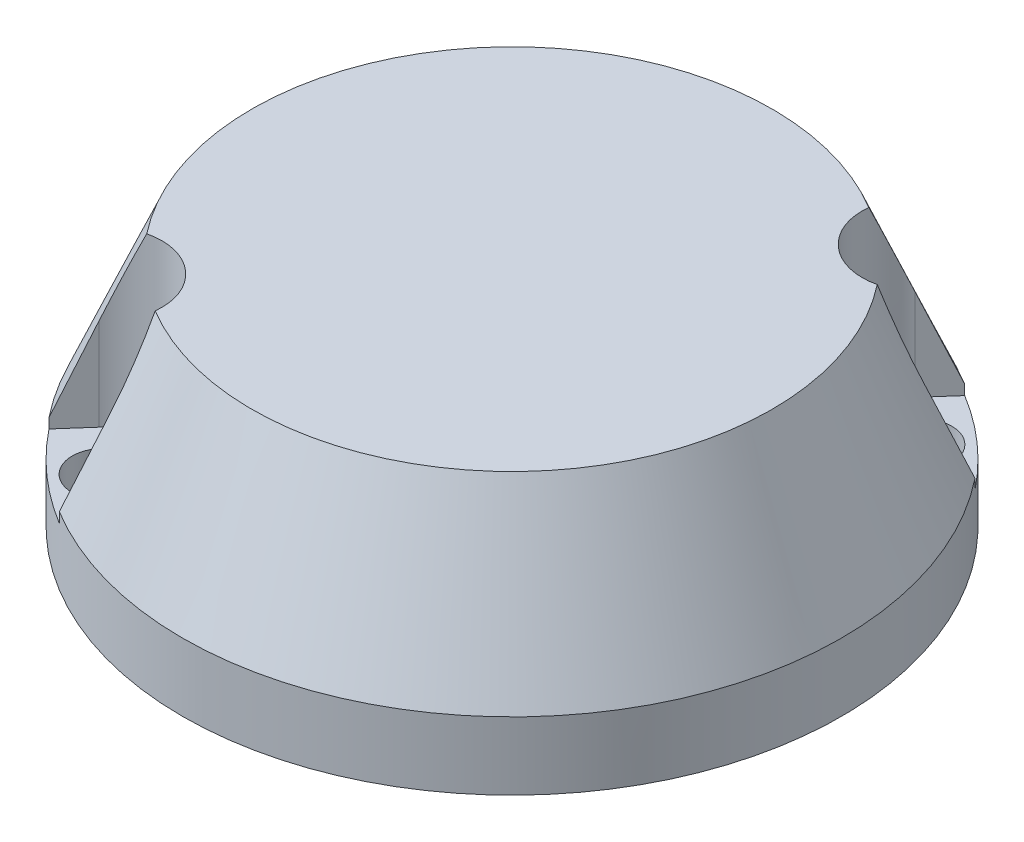
ISO-10303-21;
HEADER;
FILE_DESCRIPTION(('STEP AP214'),'2;1');
FILE_NAME('part.step','',(''),(''),'','','');
FILE_SCHEMA(('AUTOMOTIVE_DESIGN { 1 0 10303 214 1 1 1 1 }'));
ENDSEC;
DATA;
#1=APPLICATION_CONTEXT('core data for automotive mechanical design processes');
#2=APPLICATION_PROTOCOL_DEFINITION('international standard','automotive_design',2000,#1);
#3=PRODUCT_CONTEXT('',#1,'mechanical');
#4=PRODUCT('Part','Part','',(#3));
#5=PRODUCT_RELATED_PRODUCT_CATEGORY('part','',(#4));
#6=PRODUCT_DEFINITION_FORMATION('','',#4);
#7=PRODUCT_DEFINITION_CONTEXT('part definition',#1,'design');
#8=PRODUCT_DEFINITION('design','',#6,#7);
#9=PRODUCT_DEFINITION_SHAPE('','',#8);
#10=(LENGTH_UNIT() NAMED_UNIT(*) SI_UNIT(.MILLI.,.METRE.));
#11=(NAMED_UNIT(*) PLANE_ANGLE_UNIT() SI_UNIT($,.RADIAN.));
#12=(NAMED_UNIT(*) SI_UNIT($,.STERADIAN.) SOLID_ANGLE_UNIT());
#13=UNCERTAINTY_MEASURE_WITH_UNIT(LENGTH_MEASURE(1.E-05),#10,'distance_accuracy_value','');
#14=(GEOMETRIC_REPRESENTATION_CONTEXT(3) GLOBAL_UNCERTAINTY_ASSIGNED_CONTEXT((#13)) GLOBAL_UNIT_ASSIGNED_CONTEXT((#10,
#11,#12)) REPRESENTATION_CONTEXT('',''));
#15=CARTESIAN_POINT('',(0.,0.,0.));
#16=DIRECTION('',(0.,0.,1.));
#17=DIRECTION('',(1.,0.,0.));
#18=AXIS2_PLACEMENT_3D('',#15,#16,#17);
#19=CARTESIAN_POINT('',(0.,8.,0.));
#20=DIRECTION('',(0.,-1.,0.));
#21=DIRECTION('',(0.,0.,1.));
#22=AXIS2_PLACEMENT_3D('',#19,#20,#21);
#23=CONICAL_SURFACE('',#22,9.,0.401425727958697);
#24=CARTESIAN_POINT('',(5.11035817426889,5.1769811258257,-8.82550682634143));
#25=CARTESIAN_POINT('',(5.07661414252657,5.29489411257902,-8.7872079083931));
#26=CARTESIAN_POINT('',(5.04453820477151,5.41293164332908,-8.7478687942));
#27=CARTESIAN_POINT('',(4.983684376568,5.64917061454052,-8.66719651927363));
#28=CARTESIAN_POINT('',(4.95490636459641,5.76737204879977,-8.62586343209478));
#29=CARTESIAN_POINT('',(4.87366426051182,6.12121119448239,-8.49931891607739));
#30=CARTESIAN_POINT('',(4.82603701593017,6.35697873678128,-8.41127059172088));
#31=CARTESIAN_POINT('',(4.76452538524851,6.71017917982828,-8.27369323198587));
#32=CARTESIAN_POINT('',(4.74567480700492,6.82785083108504,-8.22691101713601));
#33=CARTESIAN_POINT('',(4.71139486558539,7.06293065674025,-8.13146844146397));
#34=CARTESIAN_POINT('',(4.69596532587521,7.18033884442445,-8.08280817770609));
#35=CARTESIAN_POINT('',(4.66862920523462,7.41518393202808,-7.98335906569933));
#36=CARTESIAN_POINT('',(4.65673585977857,7.53261933333602,-7.93256301305176));
#37=CARTESIAN_POINT('',(4.63681088375759,7.76690346215636,-7.82885997493883));
#38=CARTESIAN_POINT('',(4.62877983784044,7.88375209820093,-7.77595267119898));
#39=CARTESIAN_POINT('',(4.62281272466691,8.0002,-7.72192167860607));
#40=B_SPLINE_CURVE_WITH_KNOTS('',3,(#24,#25,#26,#27,#28,#29,#30,#31,#32,#33,#34,#35,#36,#37,#38,
#39),.UNSPECIFIED.,.F.,.F.,(4,2,2,2,2,2,2,4),(0.,0.385420237370538,0.770826268069996,
1.53871691019087,1.92274931952882,2.30676190720727,2.69219421135587,3.07768484119002),.UNSPECIFIED.);
#41=CARTESIAN_POINT('',(5.11018193618688,5.1775969234557,-8.82530682634147));
#42=VERTEX_POINT('',#41);
#43=CARTESIAN_POINT('',(4.62282294249551,8.,-7.72201450674221));
#44=VERTEX_POINT('',#43);
#45=EDGE_CURVE('E59',#42,#44,#40,.T.);
#46=ORIENTED_EDGE('',*,*,#45,.F.);
#47=CARTESIAN_POINT('',(5.9188669005035,2.345754322023,-9.74314888660197));
#48=CARTESIAN_POINT('',(5.78428208585492,2.81797798492162,-9.5903976806225));
#49=CARTESIAN_POINT('',(5.6495845807939,3.29012801219817,-9.43751857316731));
#50=CARTESIAN_POINT('',(5.37996418788984,4.23428080236058,-9.13150455308419));
#51=CARTESIAN_POINT('',(5.24504130004354,4.70628356524432,-8.97836964045255));
#52=CARTESIAN_POINT('',(5.11000572178152,5.17821269250383,-8.82510682634147));
#53=B_SPLINE_CURVE_WITH_KNOTS('',3,(#47,#48,#49,#50,#51,#52),.UNSPECIFIED.,.F.,.F.,(4,2,4),(0.,
1.54271507045494,3.0854301633066),.UNSPECIFIED.);
#54=CARTESIAN_POINT('',(5.91880989390462,2.34595432202301,-9.74308418519602));
#55=VERTEX_POINT('',#54);
#56=EDGE_CURVE('E12',#55,#42,#53,.T.);
#57=ORIENTED_EDGE('',*,*,#56,.F.);
#58=CARTESIAN_POINT('',(0.,2.34595432202301,0.));
#59=DIRECTION('',(0.,-1.,0.));
#60=DIRECTION('',(0.,0.,-1.));
#61=AXIS2_PLACEMENT_3D('',#58,#59,#60);
#62=CIRCLE('',#61,11.4);
#63=CARTESIAN_POINT('',(-8.9200677550985,2.345954322023,7.09875983848249));
#64=VERTEX_POINT('',#63);
#65=EDGE_CURVE('E230',#55,#64,#62,.F.);
#66=ORIENTED_EDGE('',*,*,#65,.T.);
#67=CARTESIAN_POINT('',(-8.1112635829754,5.17821269250383,6.18078247962794));
#68=CARTESIAN_POINT('',(-8.24629916123742,4.70628356524431,6.33404529373902));
#69=CARTESIAN_POINT('',(-8.38122204908373,4.23428080236058,6.48718020637066));
#70=CARTESIAN_POINT('',(-8.65084244198778,3.29012801219817,6.79319422645378));
#71=CARTESIAN_POINT('',(-8.7855399470488,2.81797798492162,6.94607333390897));
#72=CARTESIAN_POINT('',(-8.92012476169738,2.34575432202301,7.09882453988844));
#73=B_SPLINE_CURVE_WITH_KNOTS('',3,(#67,#68,#69,#70,#71,#72),.UNSPECIFIED.,.F.,.F.,(4,2,4),(0.,
1.54271509285165,3.08543016330659),.UNSPECIFIED.);
#74=CARTESIAN_POINT('',(-8.11143979738076,5.17759692345569,6.18098247962794));
#75=VERTEX_POINT('',#74);
#76=EDGE_CURVE('E207',#75,#64,#73,.T.);
#77=ORIENTED_EDGE('',*,*,#76,.F.);
#78=CARTESIAN_POINT('',(-7.0782214895987,8.0002,5.5585297014635));
#79=CARTESIAN_POINT('',(-7.13107229575632,7.88374865693116,5.57125453565555));
#80=CARTESIAN_POINT('',(-7.18254834175311,7.76689655711164,5.58588545769892));
#81=CARTESIAN_POINT('',(-7.28291902512307,7.53260547275514,5.61871369183558));
#82=CARTESIAN_POINT('',(-7.33181405191502,7.41516657969603,5.63691046395733));
#83=CARTESIAN_POINT('',(-7.42703099974391,7.18031453153924,5.67655545697273));
#84=CARTESIAN_POINT('',(-7.47336173572109,7.06290287518881,5.69799145376629));
#85=CARTESIAN_POINT('',(-7.56372924501628,6.82781610833753,5.74402072868562));
#86=CARTESIAN_POINT('',(-7.60776589979398,6.71014098454976,5.76861416973658));
#87=CARTESIAN_POINT('',(-7.7365037696514,6.35693013246042,5.8469663758237));
#88=CARTESIAN_POINT('',(-7.81785438404316,6.12115565870482,5.90530609976952));
#89=CARTESIAN_POINT('',(-7.93316152707901,5.76730614665477,6.00184319765958));
#90=CARTESIAN_POINT('',(-7.97054174753684,5.6491012431839,6.03559926896931));
#91=CARTESIAN_POINT('',(-8.04290866620123,5.41285536352392,6.10613202216484));
#92=CARTESIAN_POINT('',(-8.07789527610745,5.29481439353954,6.14290881537511));
#93=CARTESIAN_POINT('',(-8.11163979738076,5.17689798709646,6.18120951044433));
#94=B_SPLINE_CURVE_WITH_KNOTS('',3,(#78,#79,#80,#81,#82,#83,#84,#85,#86,#87,#88,#89,#90,#91,#92,
#93),.UNSPECIFIED.,.F.,.F.,(4,2,2,2,2,2,2,4),(0.,0.385502017566442,0.77094570416487,
1.15496955297277,1.53901322551055,2.3069263826477,2.69234379483585,3.07777541742072),.UNSPECIFIED.);
#95=CARTESIAN_POINT('',(-7.07831229171185,8.,5.55855152904071));
#96=VERTEX_POINT('',#95);
#97=EDGE_CURVE('E242',#96,#75,#94,.T.);
#98=ORIENTED_EDGE('',*,*,#97,.F.);
#99=CARTESIAN_POINT('',(0.,8.,0.));
#100=DIRECTION('',(0.,1.,0.));
#101=DIRECTION('',(0.,0.,1.));
#102=AXIS2_PLACEMENT_3D('',#99,#100,#101);
#103=CIRCLE('',#102,9.);
#104=EDGE_CURVE('E301',#44,#96,#103,.T.);
#105=ORIENTED_EDGE('',*,*,#104,.F.);
#106=EDGE_LOOP('',(#46,#57,#66,#77,#98,#105));
#107=FACE_BOUND('',#106,.T.);
#108=ADVANCED_FACE('F38',(#107),#23,.T.);
#109=CARTESIAN_POINT('',(6.61081086678382,8.,-7.50314465298471));
#110=DIRECTION('',(0.,-1.,0.));
#111=DIRECTION('',(0.,0.,-1.));
#112=AXIS2_PLACEMENT_3D('',#109,#110,#111);
#113=CYLINDRICAL_SURFACE('',#112,1.1);
#114=CARTESIAN_POINT('',(6.61081086678382,0.,-7.50314465298471));
#115=DIRECTION('',(0.,-1.,0.));
#116=DIRECTION('',(0.,0.,1.));
#117=AXIS2_PLACEMENT_3D('',#114,#115,#116);
#118=CIRCLE('',#117,1.1);
#119=CARTESIAN_POINT('',(6.61081086678382,0.,-6.40314465298471));
#120=VERTEX_POINT('',#119);
#121=EDGE_CURVE('E296',#120,#120,#118,.T.);
#122=ORIENTED_EDGE('',*,*,#121,.T.);
#123=EDGE_LOOP('',(#122));
#124=FACE_BOUND('',#123,.T.);
#125=CARTESIAN_POINT('',(6.61081086678382,2.,-7.50314465298471));
#126=DIRECTION('',(0.,1.,0.));
#127=DIRECTION('',(0.,0.,1.));
#128=AXIS2_PLACEMENT_3D('',#125,#126,#127);
#129=CIRCLE('',#128,1.1);
#130=CARTESIAN_POINT('',(6.61081086678382,2.,-6.40314465298471));
#131=VERTEX_POINT('',#130);
#132=EDGE_CURVE('E154',#131,#131,#129,.F.);
#133=ORIENTED_EDGE('',*,*,#132,.F.);
#134=EDGE_LOOP('',(#133));
#135=FACE_BOUND('',#134,.T.);
#136=ADVANCED_FACE('F179',(#124,#135),#113,.F.);
#137=CARTESIAN_POINT('',(-6.61081086678382,8.,7.50314465298471));
#138=DIRECTION('',(0.,-1.,0.));
#139=DIRECTION('',(0.,0.,-1.));
#140=AXIS2_PLACEMENT_3D('',#137,#138,#139);
#141=CYLINDRICAL_SURFACE('',#140,1.1);
#142=CARTESIAN_POINT('',(-6.61081086678382,0.,7.50314465298471));
#143=DIRECTION('',(0.,-1.,0.));
#144=DIRECTION('',(0.,0.,-1.));
#145=AXIS2_PLACEMENT_3D('',#142,#143,#144);
#146=CIRCLE('',#145,1.1);
#147=CARTESIAN_POINT('',(-6.61081086678382,0.,6.40314465298471));
#148=VERTEX_POINT('',#147);
#149=EDGE_CURVE('E299',#148,#148,#146,.T.);
#150=ORIENTED_EDGE('',*,*,#149,.T.);
#151=EDGE_LOOP('',(#150));
#152=FACE_BOUND('',#151,.T.);
#153=CARTESIAN_POINT('',(-6.61081086678382,2.,7.50314465298471));
#154=DIRECTION('',(0.,1.,0.));
#155=DIRECTION('',(0.,0.,1.));
#156=AXIS2_PLACEMENT_3D('',#153,#154,#155);
#157=CIRCLE('',#156,1.1);
#158=CARTESIAN_POINT('',(-6.61081086678382,2.,8.6031446529847));
#159=VERTEX_POINT('',#158);
#160=EDGE_CURVE('E237',#159,#159,#157,.F.);
#161=ORIENTED_EDGE('',*,*,#160,.F.);
#162=EDGE_LOOP('',(#161));
#163=FACE_BOUND('',#162,.T.);
#164=ADVANCED_FACE('F183',(#152,#163),#141,.F.);
#165=CARTESIAN_POINT('',(0.,8.,0.));
#166=DIRECTION('',(0.,-1.,0.));
#167=DIRECTION('',(0.,0.,-1.));
#168=AXIS2_PLACEMENT_3D('',#165,#166,#167);
#169=CYLINDRICAL_SURFACE('',#168,11.4);
#170=ORIENTED_EDGE('',*,*,#65,.F.);
#171=DIRECTION('',(0.,-1.,0.));
#172=VECTOR('',#171,1.);
#173=CARTESIAN_POINT('',(5.91880989390462,8.,-9.74308418519602));
#174=LINE('',#173,#172);
#175=CARTESIAN_POINT('',(5.91880989390462,2.,-9.74308418519602));
#176=VERTEX_POINT('',#175);
#177=EDGE_CURVE('E227',#55,#176,#174,.T.);
#178=ORIENTED_EDGE('',*,*,#177,.T.);
#179=CARTESIAN_POINT('',(0.,2.,0.));
#180=DIRECTION('',(0.,1.,0.));
#181=DIRECTION('',(0.,0.,1.));
#182=AXIS2_PLACEMENT_3D('',#179,#180,#181);
#183=CIRCLE('',#182,11.4);
#184=CARTESIAN_POINT('',(8.9200677550985,2.,-7.0987598384825));
#185=VERTEX_POINT('',#184);
#186=EDGE_CURVE('E156',#185,#176,#183,.T.);
#187=ORIENTED_EDGE('',*,*,#186,.F.);
#188=DIRECTION('',(0.,-1.,0.));
#189=VECTOR('',#188,1.);
#190=CARTESIAN_POINT('',(8.9200677550985,8.,-7.09875983848249));
#191=LINE('',#190,#189);
#192=CARTESIAN_POINT('',(8.9200677550985,2.345954322023,-7.09875983848249));
#193=VERTEX_POINT('',#192);
#194=EDGE_CURVE('E138',#185,#193,#191,.F.);
#195=ORIENTED_EDGE('',*,*,#194,.T.);
#196=CARTESIAN_POINT('',(-5.91880989390462,2.34595432202301,9.74308418519602));
#197=VERTEX_POINT('',#196);
#198=EDGE_CURVE('E225',#197,#193,#62,.F.);
#199=ORIENTED_EDGE('',*,*,#198,.F.);
#200=DIRECTION('',(0.,-1.,0.));
#201=VECTOR('',#200,1.);
#202=CARTESIAN_POINT('',(-5.91880989390462,8.,9.74308418519602));
#203=LINE('',#202,#201);
#204=CARTESIAN_POINT('',(-5.91880989390462,2.,9.74308418519602));
#205=VERTEX_POINT('',#204);
#206=EDGE_CURVE('E302',#197,#205,#203,.T.);
#207=ORIENTED_EDGE('',*,*,#206,.T.);
#208=CARTESIAN_POINT('',(0.,2.,0.));
#209=DIRECTION('',(0.,1.,0.));
#210=DIRECTION('',(0.,0.,1.));
#211=AXIS2_PLACEMENT_3D('',#208,#209,#210);
#212=CIRCLE('',#211,11.4);
#213=CARTESIAN_POINT('',(-8.9200677550985,2.,7.0987598384825));
#214=VERTEX_POINT('',#213);
#215=EDGE_CURVE('E239',#214,#205,#212,.T.);
#216=ORIENTED_EDGE('',*,*,#215,.F.);
#217=DIRECTION('',(0.,-1.,0.));
#218=VECTOR('',#217,1.);
#219=CARTESIAN_POINT('',(-8.9200677550985,8.,7.09875983848249));
#220=LINE('',#219,#218);
#221=EDGE_CURVE('E303',#214,#64,#220,.F.);
#222=ORIENTED_EDGE('',*,*,#221,.T.);
#223=EDGE_LOOP('',(#170,#178,#187,#195,#199,#207,#216,#222));
#224=FACE_BOUND('',#223,.T.);
#225=CARTESIAN_POINT('',(0.,0.,0.));
#226=DIRECTION('',(0.,1.,0.));
#227=DIRECTION('',(0.,0.,1.));
#228=AXIS2_PLACEMENT_3D('',#225,#226,#227);
#229=CIRCLE('',#228,11.4);
#230=CARTESIAN_POINT('',(0.,0.,11.4));
#231=VERTEX_POINT('',#230);
#232=EDGE_CURVE('E229',#231,#231,#229,.T.);
#233=ORIENTED_EDGE('',*,*,#232,.T.);
#234=EDGE_LOOP('',(#233));
#235=FACE_BOUND('',#234,.T.);
#236=ADVANCED_FACE('F40',(#224,#235),#169,.T.);
#237=CARTESIAN_POINT('',(0.,0.,0.));
#238=DIRECTION('',(0.,1.,0.));
#239=DIRECTION('',(0.,0.,1.));
#240=AXIS2_PLACEMENT_3D('',#237,#238,#239);
#241=PLANE('',#240);
#242=CARTESIAN_POINT('',(0.,0.,0.));
#243=DIRECTION('',(0.,-1.,0.));
#244=DIRECTION('',(0.,0.,-1.));
#245=AXIS2_PLACEMENT_3D('',#242,#243,#244);
#246=CIRCLE('',#245,7.75);
#247=CARTESIAN_POINT('',(0.,0.,-7.75));
#248=VERTEX_POINT('',#247);
#249=EDGE_CURVE('E150',#248,#248,#246,.T.);
#250=ORIENTED_EDGE('',*,*,#249,.F.);
#251=EDGE_LOOP('',(#250));
#252=FACE_BOUND('',#251,.T.);
#253=ORIENTED_EDGE('',*,*,#121,.F.);
#254=EDGE_LOOP('',(#253));
#255=FACE_BOUND('',#254,.T.);
#256=ORIENTED_EDGE('',*,*,#149,.F.);
#257=EDGE_LOOP('',(#256));
#258=FACE_BOUND('',#257,.T.);
#259=ORIENTED_EDGE('',*,*,#232,.F.);
#260=EDGE_LOOP('',(#259));
#261=FACE_BOUND('',#260,.T.);
#262=ADVANCED_FACE('F274',(#252,#255,#258,#261),#241,.F.);
#263=CARTESIAN_POINT('',(7.07822148959874,8.00019999999992,-5.55852970146351));
#264=CARTESIAN_POINT('',(7.13107229575636,7.88374865693108,-5.57125453565555));
#265=CARTESIAN_POINT('',(7.18254834175315,7.76689655711157,-5.58588545769893));
#266=CARTESIAN_POINT('',(7.2829190251231,7.53260547275507,-5.61871369183559));
#267=CARTESIAN_POINT('',(7.33181405191505,7.41516657969596,-5.63691046395734));
#268=CARTESIAN_POINT('',(7.42703099974393,7.18031453153918,-5.67655545697274));
#269=CARTESIAN_POINT('',(7.47336173572111,7.06290287518875,-5.6979914537663));
#270=CARTESIAN_POINT('',(7.5637292450163,6.82781610833748,-5.74402072868563));
#271=CARTESIAN_POINT('',(7.607765899794,6.71014098454971,-5.76861416973659));
#272=CARTESIAN_POINT('',(7.73650376965141,6.35693013246039,-5.84696637582371));
#273=CARTESIAN_POINT('',(7.81785438404317,6.12115565870479,-5.90530609976952));
#274=CARTESIAN_POINT('',(7.93316152707902,5.76730614665476,-6.00184319765958));
#275=CARTESIAN_POINT('',(7.97054174753685,5.64910124318388,-6.03559926896931));
#276=CARTESIAN_POINT('',(8.04290866620123,5.41285536352392,-6.10613202216484));
#277=CARTESIAN_POINT('',(8.07789527610745,5.29481439353954,-6.14290881537511));
#278=CARTESIAN_POINT('',(8.11163979738076,5.17689798709646,-6.18120951044433));
#279=B_SPLINE_CURVE_WITH_KNOTS('',3,(#263,#264,#265,#266,#267,#268,#269,#270,#271,#272,#273,
#274,#275,#276,#277,#278),.UNSPECIFIED.,.F.,.F.,(4,2,2,2,2,2,2,4),(0.,0.385502017566429,
0.770945704164847,1.15496955297274,1.53901322551051,2.30692638264763,2.69234379483577,
3.07777541742063),.UNSPECIFIED.);
#280=CARTESIAN_POINT('',(7.07831229171185,8.,-5.55855152904071));
#281=VERTEX_POINT('',#280);
#282=CARTESIAN_POINT('',(8.11143979738076,5.17759692345569,-6.18098247962794));
#283=VERTEX_POINT('',#282);
#284=EDGE_CURVE('E128',#281,#283,#279,.T.);
#285=ORIENTED_EDGE('',*,*,#284,.F.);
#286=CARTESIAN_POINT('',(-4.62282294249551,8.,7.72201450674221));
#287=VERTEX_POINT('',#286);
#288=EDGE_CURVE('E234',#287,#281,#103,.T.);
#289=ORIENTED_EDGE('',*,*,#288,.F.);
#290=CARTESIAN_POINT('',(-5.11035817426889,5.1769811258257,8.82550682634143));
#291=CARTESIAN_POINT('',(-5.07661414252657,5.29489411257901,8.7872079083931));
#292=CARTESIAN_POINT('',(-5.04453820477151,5.41293164332907,8.7478687942));
#293=CARTESIAN_POINT('',(-4.983684376568,5.6491706145405,8.66719651927363));
#294=CARTESIAN_POINT('',(-4.95490636459641,5.76737204879975,8.62586343209479));
#295=CARTESIAN_POINT('',(-4.87366426051182,6.12121119448236,8.4993189160774));
#296=CARTESIAN_POINT('',(-4.82603701593018,6.35697873678124,8.4112705917209));
#297=CARTESIAN_POINT('',(-4.76452538524852,6.71017917982823,8.27369323198589));
#298=CARTESIAN_POINT('',(-4.74567480700493,6.82785083108499,8.22691101713603));
#299=CARTESIAN_POINT('',(-4.7113948655854,7.0629306567402,8.13146844146399));
#300=CARTESIAN_POINT('',(-4.69596532587521,7.18033884442439,8.08280817770611));
#301=CARTESIAN_POINT('',(-4.66862920523463,7.41518393202802,7.98335906569936));
#302=CARTESIAN_POINT('',(-4.65673585977858,7.53261933333595,7.93256301305179));
#303=CARTESIAN_POINT('',(-4.6368108837576,7.76690346215628,7.82885997493886));
#304=CARTESIAN_POINT('',(-4.62877983784045,7.88375209820085,7.77595267119901));
#305=CARTESIAN_POINT('',(-4.62281272466692,8.00019999999992,7.72192167860611));
#306=B_SPLINE_CURVE_WITH_KNOTS('',3,(#290,#291,#292,#293,#294,#295,#296,#297,#298,#299,#300,
#301,#302,#303,#304,#305),.UNSPECIFIED.,.F.,.F.,(4,2,2,2,2,2,2,4),(0.,0.385420237370526,
0.770826268069973,1.53871691019083,1.92274931952877,2.3067619072072,2.69219421135579,
3.07768484118993),.UNSPECIFIED.);
#307=CARTESIAN_POINT('',(-5.11018193618688,5.1775969234557,8.82530682634147));
#308=VERTEX_POINT('',#307);
#309=EDGE_CURVE('E67',#308,#287,#306,.T.);
#310=ORIENTED_EDGE('',*,*,#309,.F.);
#311=CARTESIAN_POINT('',(-5.9188669005035,2.34575432202301,9.74314888660197));
#312=CARTESIAN_POINT('',(-5.78428208585492,2.81797798492163,9.5903976806225));
#313=CARTESIAN_POINT('',(-5.6495845807939,3.29012801219817,9.43751857316731));
#314=CARTESIAN_POINT('',(-5.37996418788984,4.23428080236058,9.13150455308419));
#315=CARTESIAN_POINT('',(-5.24504130004354,4.70628356524431,8.97836964045255));
#316=CARTESIAN_POINT('',(-5.11000572178152,5.17821269250383,8.82510682634147));
#317=B_SPLINE_CURVE_WITH_KNOTS('',3,(#311,#312,#313,#314,#315,#316),.UNSPECIFIED.,.F.,.F.,(4,2,
4),(0.,1.54271507045494,3.08543016330659),.UNSPECIFIED.);
#318=EDGE_CURVE('E200',#197,#308,#317,.T.);
#319=ORIENTED_EDGE('',*,*,#318,.F.);
#320=ORIENTED_EDGE('',*,*,#198,.T.);
#321=CARTESIAN_POINT('',(8.1112635829754,5.17821269250383,-6.18078247962794));
#322=CARTESIAN_POINT('',(8.24629916123742,4.70628356524431,-6.33404529373902));
#323=CARTESIAN_POINT('',(8.38122204908373,4.23428080236058,-6.48718020637066));
#324=CARTESIAN_POINT('',(8.65084244198778,3.29012801219817,-6.79319422645378));
#325=CARTESIAN_POINT('',(8.7855399470488,2.81797798492162,-6.94607333390897));
#326=CARTESIAN_POINT('',(8.92012476169738,2.345754322023,-7.09882453988844));
#327=B_SPLINE_CURVE_WITH_KNOTS('',3,(#321,#322,#323,#324,#325,#326),.UNSPECIFIED.,.F.,.F.,(4,2,
4),(0.,1.54271509285165,3.0854301633066),.UNSPECIFIED.);
#328=EDGE_CURVE('E52',#283,#193,#327,.T.);
#329=ORIENTED_EDGE('',*,*,#328,.F.);
#330=EDGE_LOOP('',(#285,#289,#310,#319,#320,#329));
#331=FACE_BOUND('',#330,.T.);
#332=ADVANCED_FACE('F169',(#331),#23,.T.);
#333=CARTESIAN_POINT('',(0.,8.,0.));
#334=DIRECTION('',(0.,1.,0.));
#335=DIRECTION('',(0.,0.,1.));
#336=AXIS2_PLACEMENT_3D('',#333,#334,#335);
#337=PLANE('',#336);
#338=CARTESIAN_POINT('',(6.61081086678382,8.,-7.50314465298471));
#339=DIRECTION('',(0.,1.,0.));
#340=DIRECTION('',(0.,0.,-1.));
#341=AXIS2_PLACEMENT_3D('',#338,#339,#340);
#342=CIRCLE('',#341,2.);
#343=EDGE_CURVE('E145',#44,#281,#342,.T.);
#344=ORIENTED_EDGE('',*,*,#343,.F.);
#345=ORIENTED_EDGE('',*,*,#104,.T.);
#346=CARTESIAN_POINT('',(-6.61081086678382,8.,7.50314465298471));
#347=DIRECTION('',(0.,1.,0.));
#348=DIRECTION('',(0.,0.,1.));
#349=AXIS2_PLACEMENT_3D('',#346,#347,#348);
#350=CIRCLE('',#349,2.);
#351=EDGE_CURVE('E252',#287,#96,#350,.T.);
#352=ORIENTED_EDGE('',*,*,#351,.F.);
#353=ORIENTED_EDGE('',*,*,#288,.T.);
#354=EDGE_LOOP('',(#344,#345,#352,#353));
#355=FACE_BOUND('',#354,.T.);
#356=ADVANCED_FACE('F195',(#355),#337,.T.);
#357=CARTESIAN_POINT('',(-7.53114400881407,2.,11.5730527528784));
#358=DIRECTION('',(0.750314465298471,0.,0.661081086678382));
#359=DIRECTION('',(0.661081086678382,0.,-0.750314465298471));
#360=AXIS2_PLACEMENT_3D('',#357,#358,#359);
#361=PLANE('',#360);
#362=ORIENTED_EDGE('',*,*,#318,.T.);
#363=DIRECTION('',(0.,1.,0.));
#364=VECTOR('',#363,1.);
#365=CARTESIAN_POINT('',(-5.11018193618688,2.,8.82530682634147));
#366=LINE('',#365,#364);
#367=CARTESIAN_POINT('',(-5.11018193618688,2.,8.82530682634147));
#368=VERTEX_POINT('',#367);
#369=EDGE_CURVE('E240',#368,#308,#366,.T.);
#370=ORIENTED_EDGE('',*,*,#369,.F.);
#371=DIRECTION('',(0.661081086678382,0.,-0.750314465298471));
#372=VECTOR('',#371,1.);
#373=CARTESIAN_POINT('',(-7.53114400881407,2.,11.5730527528784));
#374=LINE('',#373,#372);
#375=EDGE_CURVE('E249',#205,#368,#374,.T.);
#376=ORIENTED_EDGE('',*,*,#375,.F.);
#377=ORIENTED_EDGE('',*,*,#206,.F.);
#378=EDGE_LOOP('',(#362,#370,#376,#377));
#379=FACE_BOUND('',#378,.T.);
#380=ADVANCED_FACE('F191',(#379),#361,.F.);
#381=CARTESIAN_POINT('',(-8.11143979738076,2.,6.18098247962794));
#382=DIRECTION('',(-0.750314465298471,0.,-0.661081086678381));
#383=DIRECTION('',(-0.661081086678381,0.,0.750314465298471));
#384=AXIS2_PLACEMENT_3D('',#381,#382,#383);
#385=PLANE('',#384);
#386=DIRECTION('',(-0.661081086678381,0.,0.750314465298471));
#387=VECTOR('',#386,1.);
#388=CARTESIAN_POINT('',(-8.11143979738076,2.,6.18098247962794));
#389=LINE('',#388,#387);
#390=CARTESIAN_POINT('',(-8.11143979738076,2.,6.18098247962794));
#391=VERTEX_POINT('',#390);
#392=EDGE_CURVE('E311',#391,#214,#389,.T.);
#393=ORIENTED_EDGE('',*,*,#392,.F.);
#394=DIRECTION('',(0.,1.,0.));
#395=VECTOR('',#394,1.);
#396=CARTESIAN_POINT('',(-8.11143979738076,2.,6.18098247962794));
#397=LINE('',#396,#395);
#398=EDGE_CURVE('E244',#391,#75,#397,.T.);
#399=ORIENTED_EDGE('',*,*,#398,.T.);
#400=ORIENTED_EDGE('',*,*,#76,.T.);
#401=ORIENTED_EDGE('',*,*,#221,.F.);
#402=EDGE_LOOP('',(#393,#399,#400,#401));
#403=FACE_BOUND('',#402,.T.);
#404=ADVANCED_FACE('F189',(#403),#385,.F.);
#405=CARTESIAN_POINT('',(-6.61081086678382,2.,7.50314465298471));
#406=DIRECTION('',(0.,1.,0.));
#407=DIRECTION('',(0.,0.,1.));
#408=AXIS2_PLACEMENT_3D('',#405,#406,#407);
#409=PLANE('',#408);
#410=ORIENTED_EDGE('',*,*,#160,.T.);
#411=EDGE_LOOP('',(#410));
#412=FACE_BOUND('',#411,.T.);
#413=ORIENTED_EDGE('',*,*,#215,.T.);
#414=ORIENTED_EDGE('',*,*,#375,.T.);
#415=CARTESIAN_POINT('',(-6.61081086678382,2.,7.50314465298471));
#416=DIRECTION('',(0.,1.,0.));
#417=DIRECTION('',(0.,0.,1.));
#418=AXIS2_PLACEMENT_3D('',#415,#416,#417);
#419=CIRCLE('',#418,2.);
#420=EDGE_CURVE('E316',#368,#391,#419,.T.);
#421=ORIENTED_EDGE('',*,*,#420,.T.);
#422=ORIENTED_EDGE('',*,*,#392,.T.);
#423=EDGE_LOOP('',(#413,#414,#421,#422));
#424=FACE_BOUND('',#423,.T.);
#425=ADVANCED_FACE('F185',(#412,#424),#409,.T.);
#426=CARTESIAN_POINT('',(-6.61081086678382,2.,7.50314465298471));
#427=DIRECTION('',(0.,1.,0.));
#428=DIRECTION('',(0.,0.,1.));
#429=AXIS2_PLACEMENT_3D('',#426,#427,#428);
#430=CYLINDRICAL_SURFACE('',#429,2.);
#431=ORIENTED_EDGE('',*,*,#309,.T.);
#432=ORIENTED_EDGE('',*,*,#351,.T.);
#433=ORIENTED_EDGE('',*,*,#97,.T.);
#434=ORIENTED_EDGE('',*,*,#398,.F.);
#435=ORIENTED_EDGE('',*,*,#420,.F.);
#436=ORIENTED_EDGE('',*,*,#369,.T.);
#437=EDGE_LOOP('',(#431,#432,#433,#434,#435,#436));
#438=FACE_BOUND('',#437,.T.);
#439=ADVANCED_FACE('F188',(#438),#430,.F.);
#440=CARTESIAN_POINT('',(7.53114400881407,2.,-11.5730527528784));
#441=DIRECTION('',(-0.750314465298471,0.,-0.661081086678382));
#442=DIRECTION('',(-0.661081086678382,0.,0.750314465298471));
#443=AXIS2_PLACEMENT_3D('',#440,#441,#442);
#444=PLANE('',#443);
#445=ORIENTED_EDGE('',*,*,#56,.T.);
#446=DIRECTION('',(0.,1.,0.));
#447=VECTOR('',#446,1.);
#448=CARTESIAN_POINT('',(5.11018193618688,2.,-8.82530682634147));
#449=LINE('',#448,#447);
#450=CARTESIAN_POINT('',(5.11018193618688,2.,-8.82530682634147));
#451=VERTEX_POINT('',#450);
#452=EDGE_CURVE('E131',#451,#42,#449,.T.);
#453=ORIENTED_EDGE('',*,*,#452,.F.);
#454=DIRECTION('',(-0.661081086678382,0.,0.750314465298471));
#455=VECTOR('',#454,1.);
#456=CARTESIAN_POINT('',(7.53114400881407,2.,-11.5730527528784));
#457=LINE('',#456,#455);
#458=EDGE_CURVE('E132',#176,#451,#457,.T.);
#459=ORIENTED_EDGE('',*,*,#458,.F.);
#460=ORIENTED_EDGE('',*,*,#177,.F.);
#461=EDGE_LOOP('',(#445,#453,#459,#460));
#462=FACE_BOUND('',#461,.T.);
#463=ADVANCED_FACE('F267',(#462),#444,.F.);
#464=CARTESIAN_POINT('',(8.11143979738076,2.,-6.18098247962794));
#465=DIRECTION('',(0.750314465298471,0.,0.661081086678381));
#466=DIRECTION('',(0.661081086678381,0.,-0.750314465298471));
#467=AXIS2_PLACEMENT_3D('',#464,#465,#466);
#468=PLANE('',#467);
#469=DIRECTION('',(0.661081086678381,0.,-0.750314465298471));
#470=VECTOR('',#469,1.);
#471=CARTESIAN_POINT('',(8.11143979738076,2.,-6.18098247962794));
#472=LINE('',#471,#470);
#473=CARTESIAN_POINT('',(8.11143979738076,2.,-6.18098247962794));
#474=VERTEX_POINT('',#473);
#475=EDGE_CURVE('E135',#474,#185,#472,.T.);
#476=ORIENTED_EDGE('',*,*,#475,.F.);
#477=DIRECTION('',(0.,1.,0.));
#478=VECTOR('',#477,1.);
#479=CARTESIAN_POINT('',(8.11143979738076,2.,-6.18098247962794));
#480=LINE('',#479,#478);
#481=EDGE_CURVE('E122',#474,#283,#480,.T.);
#482=ORIENTED_EDGE('',*,*,#481,.T.);
#483=ORIENTED_EDGE('',*,*,#328,.T.);
#484=ORIENTED_EDGE('',*,*,#194,.F.);
#485=EDGE_LOOP('',(#476,#482,#483,#484));
#486=FACE_BOUND('',#485,.T.);
#487=ADVANCED_FACE('F136',(#486),#468,.F.);
#488=CARTESIAN_POINT('',(6.61081086678382,2.,-7.50314465298471));
#489=DIRECTION('',(0.,1.,0.));
#490=DIRECTION('',(0.,0.,-1.));
#491=AXIS2_PLACEMENT_3D('',#488,#489,#490);
#492=PLANE('',#491);
#493=ORIENTED_EDGE('',*,*,#132,.T.);
#494=EDGE_LOOP('',(#493));
#495=FACE_BOUND('',#494,.T.);
#496=ORIENTED_EDGE('',*,*,#186,.T.);
#497=ORIENTED_EDGE('',*,*,#458,.T.);
#498=CARTESIAN_POINT('',(6.61081086678382,2.,-7.50314465298471));
#499=DIRECTION('',(0.,1.,0.));
#500=DIRECTION('',(0.,0.,-1.));
#501=AXIS2_PLACEMENT_3D('',#498,#499,#500);
#502=CIRCLE('',#501,2.);
#503=EDGE_CURVE('E126',#451,#474,#502,.T.);
#504=ORIENTED_EDGE('',*,*,#503,.T.);
#505=ORIENTED_EDGE('',*,*,#475,.T.);
#506=EDGE_LOOP('',(#496,#497,#504,#505));
#507=FACE_BOUND('',#506,.T.);
#508=ADVANCED_FACE('F142',(#495,#507),#492,.T.);
#509=CARTESIAN_POINT('',(6.61081086678382,2.,-7.50314465298471));
#510=DIRECTION('',(0.,1.,0.));
#511=DIRECTION('',(0.,0.,1.));
#512=AXIS2_PLACEMENT_3D('',#509,#510,#511);
#513=CYLINDRICAL_SURFACE('',#512,2.);
#514=ORIENTED_EDGE('',*,*,#45,.T.);
#515=ORIENTED_EDGE('',*,*,#343,.T.);
#516=ORIENTED_EDGE('',*,*,#284,.T.);
#517=ORIENTED_EDGE('',*,*,#481,.F.);
#518=ORIENTED_EDGE('',*,*,#503,.F.);
#519=ORIENTED_EDGE('',*,*,#452,.T.);
#520=EDGE_LOOP('',(#514,#515,#516,#517,#518,#519));
#521=FACE_BOUND('',#520,.T.);
#522=ADVANCED_FACE('F124',(#521),#513,.F.);
#523=CARTESIAN_POINT('',(0.,6.5,0.));
#524=DIRECTION('',(0.,-1.,0.));
#525=DIRECTION('',(0.,0.,-1.));
#526=AXIS2_PLACEMENT_3D('',#523,#524,#525);
#527=CYLINDRICAL_SURFACE('',#526,7.75);
#528=CARTESIAN_POINT('',(0.,6.5,0.));
#529=DIRECTION('',(0.,-1.,0.));
#530=DIRECTION('',(0.,0.,-1.));
#531=AXIS2_PLACEMENT_3D('',#528,#529,#530);
#532=CIRCLE('',#531,7.75);
#533=CARTESIAN_POINT('',(0.,6.5,-7.75));
#534=VERTEX_POINT('',#533);
#535=EDGE_CURVE('E147',#534,#534,#532,.T.);
#536=CARTESIAN_POINT('',(0.,6.5,-7.75));
#537=CARTESIAN_POINT('',(0.,6.43229166666667,-7.75));
#538=CARTESIAN_POINT('',(0.,6.36458333333333,-7.75));
#539=CARTESIAN_POINT('',(0.,6.22916666666667,-7.75));
#540=CARTESIAN_POINT('',(0.,6.16145833333333,-7.75));
#541=CARTESIAN_POINT('',(0.,6.02604166666667,-7.75));
#542=CARTESIAN_POINT('',(0.,5.95833333333333,-7.75));
#543=CARTESIAN_POINT('',(0.,5.82291666666667,-7.75));
#544=CARTESIAN_POINT('',(0.,5.75520833333333,-7.75));
#545=CARTESIAN_POINT('',(0.,5.61979166666667,-7.75));
#546=CARTESIAN_POINT('',(0.,5.55208333333333,-7.75));
#547=CARTESIAN_POINT('',(0.,5.41666666666667,-7.75));
#548=CARTESIAN_POINT('',(0.,5.34895833333333,-7.75));
#549=CARTESIAN_POINT('',(0.,5.21354166666667,-7.75));
#550=CARTESIAN_POINT('',(0.,5.14583333333333,-7.75));
#551=CARTESIAN_POINT('',(0.,5.01041666666667,-7.75));
#552=CARTESIAN_POINT('',(0.,4.94270833333333,-7.75));
#553=CARTESIAN_POINT('',(0.,4.80729166666667,-7.75));
#554=CARTESIAN_POINT('',(0.,4.73958333333333,-7.75));
#555=CARTESIAN_POINT('',(0.,4.60416666666667,-7.75));
#556=CARTESIAN_POINT('',(0.,4.53645833333333,-7.75));
#557=CARTESIAN_POINT('',(0.,4.40104166666667,-7.75));
#558=CARTESIAN_POINT('',(0.,4.33333333333333,-7.75));
#559=CARTESIAN_POINT('',(0.,4.19791666666667,-7.75));
#560=CARTESIAN_POINT('',(0.,4.13020833333333,-7.75));
#561=CARTESIAN_POINT('',(0.,3.99479166666667,-7.75));
#562=CARTESIAN_POINT('',(0.,3.92708333333333,-7.75));
#563=CARTESIAN_POINT('',(0.,3.79166666666667,-7.75));
#564=CARTESIAN_POINT('',(0.,3.72395833333333,-7.75));
#565=CARTESIAN_POINT('',(0.,3.58854166666667,-7.75));
#566=CARTESIAN_POINT('',(0.,3.52083333333333,-7.75));
#567=CARTESIAN_POINT('',(0.,3.38541666666667,-7.75));
#568=CARTESIAN_POINT('',(0.,3.31770833333333,-7.75));
#569=CARTESIAN_POINT('',(0.,3.18229166666667,-7.75));
#570=CARTESIAN_POINT('',(0.,3.11458333333333,-7.75));
#571=CARTESIAN_POINT('',(0.,2.97916666666667,-7.75));
#572=CARTESIAN_POINT('',(0.,2.91145833333333,-7.75));
#573=CARTESIAN_POINT('',(0.,2.77604166666667,-7.75));
#574=CARTESIAN_POINT('',(0.,2.70833333333333,-7.75));
#575=CARTESIAN_POINT('',(0.,2.57291666666667,-7.75));
#576=CARTESIAN_POINT('',(0.,2.50520833333333,-7.75));
#577=CARTESIAN_POINT('',(0.,2.36979166666667,-7.75));
#578=CARTESIAN_POINT('',(0.,2.30208333333333,-7.75));
#579=CARTESIAN_POINT('',(0.,2.16666666666667,-7.75));
#580=CARTESIAN_POINT('',(0.,2.09895833333333,-7.75));
#581=CARTESIAN_POINT('',(0.,1.96354166666667,-7.75));
#582=CARTESIAN_POINT('',(0.,1.89583333333333,-7.75));
#583=CARTESIAN_POINT('',(0.,1.76041666666667,-7.75));
#584=CARTESIAN_POINT('',(0.,1.69270833333333,-7.75));
#585=CARTESIAN_POINT('',(0.,1.55729166666667,-7.75));
#586=CARTESIAN_POINT('',(0.,1.48958333333333,-7.75));
#587=CARTESIAN_POINT('',(0.,1.35416666666667,-7.75));
#588=CARTESIAN_POINT('',(0.,1.28645833333333,-7.75));
#589=CARTESIAN_POINT('',(0.,1.15104166666667,-7.75));
#590=CARTESIAN_POINT('',(0.,1.08333333333333,-7.75));
#591=CARTESIAN_POINT('',(0.,0.947916666666667,-7.75));
#592=CARTESIAN_POINT('',(0.,0.880208333333333,-7.75));
#593=CARTESIAN_POINT('',(0.,0.744791666666667,-7.75));
#594=CARTESIAN_POINT('',(0.,0.677083333333334,-7.75));
#595=CARTESIAN_POINT('',(0.,0.541666666666667,-7.75));
#596=CARTESIAN_POINT('',(0.,0.473958333333334,-7.75));
#597=CARTESIAN_POINT('',(0.,0.338541666666667,-7.75));
#598=CARTESIAN_POINT('',(0.,0.270833333333334,-7.75));
#599=CARTESIAN_POINT('',(0.,0.135416666666667,-7.75));
#600=CARTESIAN_POINT('',(0.,0.0677083333333333,-7.75));
#601=CARTESIAN_POINT('',(0.,0.,-7.75));
#602=B_SPLINE_CURVE_WITH_KNOTS('',3,(#536,#537,#538,#539,#540,#541,#542,#543,#544,#545,#546,
#547,#548,#549,#550,#551,#552,#553,#554,#555,#556,#557,#558,#559,#560,#561,#562,#563,#564,#565,
#566,#567,#568,#569,#570,#571,#572,#573,#574,#575,#576,#577,#578,#579,#580,#581,#582,#583,#584,
#585,#586,#587,#588,#589,#590,#591,#592,#593,#594,#595,#596,#597,#598,#599,#600,#601),
.UNSPECIFIED.,.F.,.F.,(4,2,2,2,2,2,2,2,2,2,2,2,2,2,2,2,2,2,2,2,2,2,2,2,2,2,2,2,2,2,2,2,4),(0.,
0.203125,0.40625,0.609375000000001,0.812500000000001,1.015625,1.21875,1.421875,1.625,1.828125,
2.03125,2.234375,2.4375,2.640625,2.84375,3.046875,3.25,3.453125,3.65625,3.859375,4.0625,
4.265625,4.46875,4.671875,4.875,5.078125,5.28125,5.484375,5.6875,5.890625,6.09375,6.296875,6.5),.UNSPECIFIED.);
#603=EDGE_CURVE('BSEAM177',#534,#248,#602,.T.);
#604=ORIENTED_EDGE('',*,*,#535,.F.);
#605=ORIENTED_EDGE('',*,*,#249,.T.);
#606=ORIENTED_EDGE('',*,*,#603,.T.);
#607=ORIENTED_EDGE('',*,*,#603,.F.);
#608=EDGE_LOOP('',(#604,#606,#605,#607));
#609=FACE_BOUND('',#608,.T.);
#610=ADVANCED_FACE('F177',(#609),#527,.F.);
#611=CARTESIAN_POINT('',(0.,6.5,0.));
#612=DIRECTION('',(0.,-1.,0.));
#613=DIRECTION('',(0.,0.,-1.));
#614=AXIS2_PLACEMENT_3D('',#611,#612,#613);
#615=PLANE('',#614);
#616=ORIENTED_EDGE('',*,*,#535,.T.);
#617=EDGE_LOOP('',(#616));
#618=FACE_BOUND('',#617,.T.);
#619=ADVANCED_FACE('F338',(#618),#615,.T.);
#620=CLOSED_SHELL('',(#108,#136,#164,#236,#262,#332,#356,#380,#404,#425,#439,#463,#487,#508,
#522,#610,#619));
#621=MANIFOLD_SOLID_BREP('B2',#620);
#622=ADVANCED_BREP_SHAPE_REPRESENTATION('',(#18,#621),#14);
#623=SHAPE_DEFINITION_REPRESENTATION(#9,#622);
ENDSEC;
END-ISO-10303-21;
